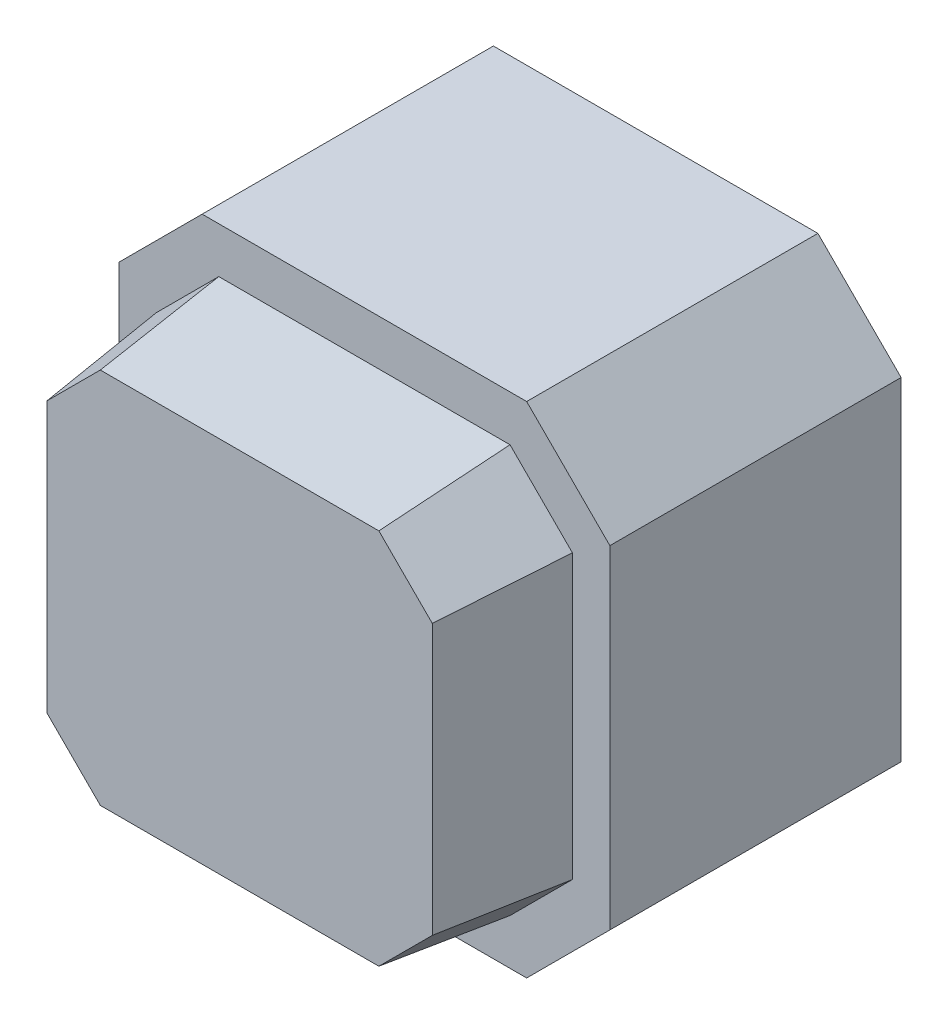
ISO-10303-21;
HEADER;
FILE_DESCRIPTION(('STEP AP214'),'2;1');
FILE_NAME('part.step','',(''),(''),'','','');
FILE_SCHEMA(('AUTOMOTIVE_DESIGN { 1 0 10303 214 1 1 1 1 }'));
ENDSEC;
DATA;
#1=APPLICATION_CONTEXT('core data for automotive mechanical design processes');
#2=APPLICATION_PROTOCOL_DEFINITION('international standard','automotive_design',2000,#1);
#3=PRODUCT_CONTEXT('',#1,'mechanical');
#4=PRODUCT('Part','Part','',(#3));
#5=PRODUCT_RELATED_PRODUCT_CATEGORY('part','',(#4));
#6=PRODUCT_DEFINITION_FORMATION('','',#4);
#7=PRODUCT_DEFINITION_CONTEXT('part definition',#1,'design');
#8=PRODUCT_DEFINITION('design','',#6,#7);
#9=PRODUCT_DEFINITION_SHAPE('','',#8);
#10=(LENGTH_UNIT() NAMED_UNIT(*) SI_UNIT(.MILLI.,.METRE.));
#11=(NAMED_UNIT(*) PLANE_ANGLE_UNIT() SI_UNIT($,.RADIAN.));
#12=(NAMED_UNIT(*) SI_UNIT($,.STERADIAN.) SOLID_ANGLE_UNIT());
#13=UNCERTAINTY_MEASURE_WITH_UNIT(LENGTH_MEASURE(1.E-05),#10,'distance_accuracy_value','');
#14=(GEOMETRIC_REPRESENTATION_CONTEXT(3) GLOBAL_UNCERTAINTY_ASSIGNED_CONTEXT((#13)) GLOBAL_UNIT_ASSIGNED_CONTEXT((#10,
#11,#12)) REPRESENTATION_CONTEXT('',''));
#15=CARTESIAN_POINT('',(0.,0.,0.));
#16=DIRECTION('',(0.,0.,1.));
#17=DIRECTION('',(1.,0.,0.));
#18=AXIS2_PLACEMENT_3D('',#15,#16,#17);
#19=CARTESIAN_POINT('',(0.,0.,3.5));
#20=DIRECTION('',(0.,0.,-1.));
#21=DIRECTION('',(-1.,0.,0.));
#22=AXIS2_PLACEMENT_3D('',#19,#20,#21);
#23=PLANE('',#22);
#24=DIRECTION('',(0.,-1.,0.));
#25=VECTOR('',#24,1.);
#26=CARTESIAN_POINT('',(-2.95,-2.,3.5));
#27=LINE('',#26,#25);
#28=CARTESIAN_POINT('',(-2.95,2.,3.5));
#29=VERTEX_POINT('',#28);
#30=CARTESIAN_POINT('',(-2.95,-2.,3.5));
#31=VERTEX_POINT('',#30);
#32=EDGE_CURVE('E241',#29,#31,#27,.T.);
#33=ORIENTED_EDGE('',*,*,#32,.T.);
#34=DIRECTION('',(0.707106781186548,-0.707106781186548,0.));
#35=VECTOR('',#34,1.);
#36=CARTESIAN_POINT('',(-1.95,-3.,3.5));
#37=LINE('',#36,#35);
#38=CARTESIAN_POINT('',(-1.95,-3.,3.5));
#39=VERTEX_POINT('',#38);
#40=EDGE_CURVE('E245',#31,#39,#37,.T.);
#41=ORIENTED_EDGE('',*,*,#40,.T.);
#42=DIRECTION('',(1.,0.,0.));
#43=VECTOR('',#42,1.);
#44=CARTESIAN_POINT('',(-1.95,-3.,3.5));
#45=LINE('',#44,#43);
#46=CARTESIAN_POINT('',(1.95,-3.,3.5));
#47=VERTEX_POINT('',#46);
#48=EDGE_CURVE('E249',#39,#47,#45,.T.);
#49=ORIENTED_EDGE('',*,*,#48,.T.);
#50=DIRECTION('',(0.707106781186548,0.707106781186548,0.));
#51=VECTOR('',#50,1.);
#52=CARTESIAN_POINT('',(1.95,-3.,3.5));
#53=LINE('',#52,#51);
#54=CARTESIAN_POINT('',(2.95,-2.,3.5));
#55=VERTEX_POINT('',#54);
#56=EDGE_CURVE('E252',#47,#55,#53,.T.);
#57=ORIENTED_EDGE('',*,*,#56,.T.);
#58=DIRECTION('',(0.,1.,0.));
#59=VECTOR('',#58,1.);
#60=CARTESIAN_POINT('',(2.95,-2.,3.5));
#61=LINE('',#60,#59);
#62=CARTESIAN_POINT('',(2.95,2.,3.5));
#63=VERTEX_POINT('',#62);
#64=EDGE_CURVE('E255',#55,#63,#61,.T.);
#65=ORIENTED_EDGE('',*,*,#64,.T.);
#66=DIRECTION('',(-0.707106781186548,0.707106781186548,0.));
#67=VECTOR('',#66,1.);
#68=CARTESIAN_POINT('',(1.95,3.,3.5));
#69=LINE('',#68,#67);
#70=CARTESIAN_POINT('',(1.95,3.,3.5));
#71=VERTEX_POINT('',#70);
#72=EDGE_CURVE('E258',#63,#71,#69,.T.);
#73=ORIENTED_EDGE('',*,*,#72,.T.);
#74=DIRECTION('',(-1.,0.,0.));
#75=VECTOR('',#74,1.);
#76=CARTESIAN_POINT('',(-1.95,3.,3.5));
#77=LINE('',#76,#75);
#78=CARTESIAN_POINT('',(-1.95,3.,3.5));
#79=VERTEX_POINT('',#78);
#80=EDGE_CURVE('E261',#71,#79,#77,.T.);
#81=ORIENTED_EDGE('',*,*,#80,.T.);
#82=DIRECTION('',(-0.707106781186548,-0.707106781186548,0.));
#83=VECTOR('',#82,1.);
#84=CARTESIAN_POINT('',(-2.95,2.,3.5));
#85=LINE('',#84,#83);
#86=EDGE_CURVE('E264',#79,#29,#85,.T.);
#87=ORIENTED_EDGE('',*,*,#86,.T.);
#88=EDGE_LOOP('',(#33,#41,#49,#57,#65,#73,#81,#87));
#89=FACE_BOUND('',#88,.T.);
#90=DIRECTION('',(0.,-1.,0.));
#91=VECTOR('',#90,1.);
#92=CARTESIAN_POINT('',(-2.5,-1.7,3.5));
#93=LINE('',#92,#91);
#94=CARTESIAN_POINT('',(-2.5,1.7,3.5));
#95=VERTEX_POINT('',#94);
#96=CARTESIAN_POINT('',(-2.5,-1.7,3.5));
#97=VERTEX_POINT('',#96);
#98=EDGE_CURVE('E59',#95,#97,#93,.T.);
#99=ORIENTED_EDGE('',*,*,#98,.F.);
#100=DIRECTION('',(-0.707106781186548,-0.707106781186548,0.));
#101=VECTOR('',#100,1.);
#102=CARTESIAN_POINT('',(-2.5,1.7,3.5));
#103=LINE('',#102,#101);
#104=CARTESIAN_POINT('',(-1.75,2.45,3.5));
#105=VERTEX_POINT('',#104);
#106=EDGE_CURVE('E66',#105,#95,#103,.T.);
#107=ORIENTED_EDGE('',*,*,#106,.F.);
#108=DIRECTION('',(-1.,0.,0.));
#109=VECTOR('',#108,1.);
#110=CARTESIAN_POINT('',(-1.75,2.45,3.5));
#111=LINE('',#110,#109);
#112=CARTESIAN_POINT('',(1.75,2.45,3.5));
#113=VERTEX_POINT('',#112);
#114=EDGE_CURVE('E547',#113,#105,#111,.T.);
#115=ORIENTED_EDGE('',*,*,#114,.F.);
#116=DIRECTION('',(-0.707106781186548,0.707106781186548,0.));
#117=VECTOR('',#116,1.);
#118=CARTESIAN_POINT('',(1.75,2.45,3.5));
#119=LINE('',#118,#117);
#120=CARTESIAN_POINT('',(2.5,1.7,3.5));
#121=VERTEX_POINT('',#120);
#122=EDGE_CURVE('E543',#121,#113,#119,.T.);
#123=ORIENTED_EDGE('',*,*,#122,.F.);
#124=DIRECTION('',(0.,1.,0.));
#125=VECTOR('',#124,1.);
#126=CARTESIAN_POINT('',(2.5,-1.7,3.5));
#127=LINE('',#126,#125);
#128=CARTESIAN_POINT('',(2.5,-1.7,3.5));
#129=VERTEX_POINT('',#128);
#130=EDGE_CURVE('E539',#129,#121,#127,.T.);
#131=ORIENTED_EDGE('',*,*,#130,.F.);
#132=DIRECTION('',(0.707106781186548,0.707106781186548,0.));
#133=VECTOR('',#132,1.);
#134=CARTESIAN_POINT('',(1.75,-2.45,3.5));
#135=LINE('',#134,#133);
#136=CARTESIAN_POINT('',(1.75,-2.45,3.5));
#137=VERTEX_POINT('',#136);
#138=EDGE_CURVE('E187',#137,#129,#135,.T.);
#139=ORIENTED_EDGE('',*,*,#138,.F.);
#140=DIRECTION('',(1.,0.,0.));
#141=VECTOR('',#140,1.);
#142=CARTESIAN_POINT('',(-1.75,-2.45,3.5));
#143=LINE('',#142,#141);
#144=CARTESIAN_POINT('',(-1.75,-2.45,3.5));
#145=VERTEX_POINT('',#144);
#146=EDGE_CURVE('E182',#145,#137,#143,.T.);
#147=ORIENTED_EDGE('',*,*,#146,.F.);
#148=DIRECTION('',(0.707106781186548,-0.707106781186548,0.));
#149=VECTOR('',#148,1.);
#150=CARTESIAN_POINT('',(-2.5,-1.7,3.5));
#151=LINE('',#150,#149);
#152=EDGE_CURVE('E184',#97,#145,#151,.T.);
#153=ORIENTED_EDGE('',*,*,#152,.F.);
#154=EDGE_LOOP('',(#99,#107,#115,#123,#131,#139,#147,#153));
#155=FACE_BOUND('',#154,.T.);
#156=ADVANCED_FACE('F40',(#89,#155),#23,.F.);
#157=CARTESIAN_POINT('',(-2.95,-2.,3.5));
#158=DIRECTION('',(1.,0.,0.));
#159=DIRECTION('',(0.,0.,-1.));
#160=AXIS2_PLACEMENT_3D('',#157,#158,#159);
#161=PLANE('',#160);
#162=DIRECTION('',(0.,-1.,0.));
#163=VECTOR('',#162,1.);
#164=CARTESIAN_POINT('',(-2.95,-2.,0.));
#165=LINE('',#164,#163);
#166=CARTESIAN_POINT('',(-2.95,2.,0.));
#167=VERTEX_POINT('',#166);
#168=CARTESIAN_POINT('',(-2.95,-2.,0.));
#169=VERTEX_POINT('',#168);
#170=EDGE_CURVE('E210',#167,#169,#165,.T.);
#171=ORIENTED_EDGE('',*,*,#170,.T.);
#172=DIRECTION('',(0.,0.,-1.));
#173=VECTOR('',#172,1.);
#174=CARTESIAN_POINT('',(-2.95,-2.,3.5));
#175=LINE('',#174,#173);
#176=EDGE_CURVE('E11',#31,#169,#175,.T.);
#177=ORIENTED_EDGE('',*,*,#176,.F.);
#178=ORIENTED_EDGE('',*,*,#32,.F.);
#179=DIRECTION('',(0.,0.,-1.));
#180=VECTOR('',#179,1.);
#181=CARTESIAN_POINT('',(-2.95,2.,3.5));
#182=LINE('',#181,#180);
#183=EDGE_CURVE('E267',#29,#167,#182,.T.);
#184=ORIENTED_EDGE('',*,*,#183,.T.);
#185=EDGE_LOOP('',(#171,#177,#178,#184));
#186=FACE_BOUND('',#185,.T.);
#187=ADVANCED_FACE('F42',(#186),#161,.F.);
#188=CARTESIAN_POINT('',(-1.95,-3.,3.5));
#189=DIRECTION('',(0.707106781186547,0.707106781186547,0.));
#190=DIRECTION('',(-0.707106781186548,0.707106781186548,0.));
#191=AXIS2_PLACEMENT_3D('',#188,#189,#190);
#192=PLANE('',#191);
#193=DIRECTION('',(0.707106781186548,-0.707106781186548,0.));
#194=VECTOR('',#193,1.);
#195=CARTESIAN_POINT('',(-1.95,-3.,0.));
#196=LINE('',#195,#194);
#197=CARTESIAN_POINT('',(-1.95,-3.,0.));
#198=VERTEX_POINT('',#197);
#199=EDGE_CURVE('E271',#169,#198,#196,.T.);
#200=ORIENTED_EDGE('',*,*,#199,.T.);
#201=DIRECTION('',(0.,0.,-1.));
#202=VECTOR('',#201,1.);
#203=CARTESIAN_POINT('',(-1.95,-3.,3.5));
#204=LINE('',#203,#202);
#205=EDGE_CURVE('E49',#39,#198,#204,.T.);
#206=ORIENTED_EDGE('',*,*,#205,.F.);
#207=ORIENTED_EDGE('',*,*,#40,.F.);
#208=ORIENTED_EDGE('',*,*,#176,.T.);
#209=EDGE_LOOP('',(#200,#206,#207,#208));
#210=FACE_BOUND('',#209,.T.);
#211=ADVANCED_FACE('F341',(#210),#192,.F.);
#212=CARTESIAN_POINT('',(-1.95,-3.,3.5));
#213=DIRECTION('',(0.,1.,0.));
#214=DIRECTION('',(0.,0.,1.));
#215=AXIS2_PLACEMENT_3D('',#212,#213,#214);
#216=PLANE('',#215);
#217=DIRECTION('',(1.,0.,0.));
#218=VECTOR('',#217,1.);
#219=CARTESIAN_POINT('',(-1.95,-3.,0.));
#220=LINE('',#219,#218);
#221=CARTESIAN_POINT('',(1.95,-3.,0.));
#222=VERTEX_POINT('',#221);
#223=EDGE_CURVE('E274',#198,#222,#220,.T.);
#224=ORIENTED_EDGE('',*,*,#223,.T.);
#225=DIRECTION('',(0.,0.,-1.));
#226=VECTOR('',#225,1.);
#227=CARTESIAN_POINT('',(1.95,-3.,3.5));
#228=LINE('',#227,#226);
#229=EDGE_CURVE('E310',#47,#222,#228,.T.);
#230=ORIENTED_EDGE('',*,*,#229,.F.);
#231=ORIENTED_EDGE('',*,*,#48,.F.);
#232=ORIENTED_EDGE('',*,*,#205,.T.);
#233=EDGE_LOOP('',(#224,#230,#231,#232));
#234=FACE_BOUND('',#233,.T.);
#235=ADVANCED_FACE('F319',(#234),#216,.F.);
#236=CARTESIAN_POINT('',(1.95,-3.,3.5));
#237=DIRECTION('',(-0.707106781186547,0.707106781186547,0.));
#238=DIRECTION('',(-0.707106781186548,-0.707106781186548,0.));
#239=AXIS2_PLACEMENT_3D('',#236,#237,#238);
#240=PLANE('',#239);
#241=DIRECTION('',(0.707106781186548,0.707106781186548,0.));
#242=VECTOR('',#241,1.);
#243=CARTESIAN_POINT('',(1.95,-3.,0.));
#244=LINE('',#243,#242);
#245=CARTESIAN_POINT('',(2.95,-2.,0.));
#246=VERTEX_POINT('',#245);
#247=EDGE_CURVE('E277',#222,#246,#244,.T.);
#248=ORIENTED_EDGE('',*,*,#247,.T.);
#249=DIRECTION('',(0.,0.,-1.));
#250=VECTOR('',#249,1.);
#251=CARTESIAN_POINT('',(2.95,-2.,3.5));
#252=LINE('',#251,#250);
#253=EDGE_CURVE('E306',#55,#246,#252,.T.);
#254=ORIENTED_EDGE('',*,*,#253,.F.);
#255=ORIENTED_EDGE('',*,*,#56,.F.);
#256=ORIENTED_EDGE('',*,*,#229,.T.);
#257=EDGE_LOOP('',(#248,#254,#255,#256));
#258=FACE_BOUND('',#257,.T.);
#259=ADVANCED_FACE('F330',(#258),#240,.F.);
#260=CARTESIAN_POINT('',(2.95,-2.,3.5));
#261=DIRECTION('',(-1.,0.,0.));
#262=DIRECTION('',(0.,0.,1.));
#263=AXIS2_PLACEMENT_3D('',#260,#261,#262);
#264=PLANE('',#263);
#265=DIRECTION('',(0.,1.,0.));
#266=VECTOR('',#265,1.);
#267=CARTESIAN_POINT('',(2.95,-2.,0.));
#268=LINE('',#267,#266);
#269=CARTESIAN_POINT('',(2.95,2.,0.));
#270=VERTEX_POINT('',#269);
#271=EDGE_CURVE('E280',#246,#270,#268,.T.);
#272=ORIENTED_EDGE('',*,*,#271,.T.);
#273=DIRECTION('',(0.,0.,-1.));
#274=VECTOR('',#273,1.);
#275=CARTESIAN_POINT('',(2.95,2.,3.5));
#276=LINE('',#275,#274);
#277=EDGE_CURVE('E302',#63,#270,#276,.T.);
#278=ORIENTED_EDGE('',*,*,#277,.F.);
#279=ORIENTED_EDGE('',*,*,#64,.F.);
#280=ORIENTED_EDGE('',*,*,#253,.T.);
#281=EDGE_LOOP('',(#272,#278,#279,#280));
#282=FACE_BOUND('',#281,.T.);
#283=ADVANCED_FACE('F334',(#282),#264,.F.);
#284=CARTESIAN_POINT('',(1.95,3.,3.5));
#285=DIRECTION('',(-0.707106781186547,-0.707106781186547,0.));
#286=DIRECTION('',(0.707106781186548,-0.707106781186548,0.));
#287=AXIS2_PLACEMENT_3D('',#284,#285,#286);
#288=PLANE('',#287);
#289=DIRECTION('',(-0.707106781186548,0.707106781186548,0.));
#290=VECTOR('',#289,1.);
#291=CARTESIAN_POINT('',(1.95,3.,0.));
#292=LINE('',#291,#290);
#293=CARTESIAN_POINT('',(1.95,3.,0.));
#294=VERTEX_POINT('',#293);
#295=EDGE_CURVE('E283',#270,#294,#292,.T.);
#296=ORIENTED_EDGE('',*,*,#295,.T.);
#297=DIRECTION('',(0.,0.,-1.));
#298=VECTOR('',#297,1.);
#299=CARTESIAN_POINT('',(1.95,3.,3.5));
#300=LINE('',#299,#298);
#301=EDGE_CURVE('E298',#71,#294,#300,.T.);
#302=ORIENTED_EDGE('',*,*,#301,.F.);
#303=ORIENTED_EDGE('',*,*,#72,.F.);
#304=ORIENTED_EDGE('',*,*,#277,.T.);
#305=EDGE_LOOP('',(#296,#302,#303,#304));
#306=FACE_BOUND('',#305,.T.);
#307=ADVANCED_FACE('F354',(#306),#288,.F.);
#308=CARTESIAN_POINT('',(-1.95,3.,3.5));
#309=DIRECTION('',(0.,-1.,0.));
#310=DIRECTION('',(0.,0.,-1.));
#311=AXIS2_PLACEMENT_3D('',#308,#309,#310);
#312=PLANE('',#311);
#313=DIRECTION('',(-1.,0.,0.));
#314=VECTOR('',#313,1.);
#315=CARTESIAN_POINT('',(-1.95,3.,0.));
#316=LINE('',#315,#314);
#317=CARTESIAN_POINT('',(-1.95,3.,0.));
#318=VERTEX_POINT('',#317);
#319=EDGE_CURVE('E286',#294,#318,#316,.T.);
#320=ORIENTED_EDGE('',*,*,#319,.T.);
#321=DIRECTION('',(0.,0.,-1.));
#322=VECTOR('',#321,1.);
#323=CARTESIAN_POINT('',(-1.95,3.,3.5));
#324=LINE('',#323,#322);
#325=EDGE_CURVE('E294',#79,#318,#324,.T.);
#326=ORIENTED_EDGE('',*,*,#325,.F.);
#327=ORIENTED_EDGE('',*,*,#80,.F.);
#328=ORIENTED_EDGE('',*,*,#301,.T.);
#329=EDGE_LOOP('',(#320,#326,#327,#328));
#330=FACE_BOUND('',#329,.T.);
#331=ADVANCED_FACE('F352',(#330),#312,.F.);
#332=CARTESIAN_POINT('',(-2.95,2.,3.5));
#333=DIRECTION('',(0.707106781186547,-0.707106781186547,0.));
#334=DIRECTION('',(0.707106781186548,0.707106781186548,0.));
#335=AXIS2_PLACEMENT_3D('',#332,#333,#334);
#336=PLANE('',#335);
#337=DIRECTION('',(-0.707106781186548,-0.707106781186548,0.));
#338=VECTOR('',#337,1.);
#339=CARTESIAN_POINT('',(-2.95,2.,0.));
#340=LINE('',#339,#338);
#341=EDGE_CURVE('E246',#318,#167,#340,.T.);
#342=ORIENTED_EDGE('',*,*,#341,.T.);
#343=ORIENTED_EDGE('',*,*,#183,.F.);
#344=ORIENTED_EDGE('',*,*,#86,.F.);
#345=ORIENTED_EDGE('',*,*,#325,.T.);
#346=EDGE_LOOP('',(#342,#343,#344,#345));
#347=FACE_BOUND('',#346,.T.);
#348=ADVANCED_FACE('F347',(#347),#336,.F.);
#349=CARTESIAN_POINT('',(0.,0.,0.));
#350=DIRECTION('',(0.,0.,-1.));
#351=DIRECTION('',(-1.,0.,0.));
#352=AXIS2_PLACEMENT_3D('',#349,#350,#351);
#353=PLANE('',#352);
#354=ORIENTED_EDGE('',*,*,#170,.F.);
#355=ORIENTED_EDGE('',*,*,#341,.F.);
#356=ORIENTED_EDGE('',*,*,#319,.F.);
#357=ORIENTED_EDGE('',*,*,#295,.F.);
#358=ORIENTED_EDGE('',*,*,#271,.F.);
#359=ORIENTED_EDGE('',*,*,#247,.F.);
#360=ORIENTED_EDGE('',*,*,#223,.F.);
#361=ORIENTED_EDGE('',*,*,#199,.F.);
#362=EDGE_LOOP('',(#354,#355,#356,#357,#358,#359,#360,#361));
#363=FACE_BOUND('',#362,.T.);
#364=ADVANCED_FACE('F325',(#363),#353,.T.);
#365=CARTESIAN_POINT('',(-2.5,-1.7,3.5));
#366=DIRECTION('',(-0.992546151641322,0.,0.121869343405148));
#367=DIRECTION('',(0.121869343405148,0.,0.992546151641322));
#368=AXIS2_PLACEMENT_3D('',#365,#366,#367);
#369=PLANE('',#368);
#370=ORIENTED_EDGE('',*,*,#98,.T.);
#371=DIRECTION('',(-0.121714364351113,-0.0504157404498515,-0.991283948536189));
#372=VECTOR('',#371,1.);
#373=CARTESIAN_POINT('',(-2.5,-1.7,3.5));
#374=LINE('',#373,#372);
#375=CARTESIAN_POINT('',(-2.31582315864564,-1.62371145443599,5.));
#376=VERTEX_POINT('',#375);
#377=EDGE_CURVE('E200',#376,#97,#374,.T.);
#378=ORIENTED_EDGE('',*,*,#377,.F.);
#379=DIRECTION('',(0.,1.,0.));
#380=VECTOR('',#379,1.);
#381=CARTESIAN_POINT('',(-2.31582315864564,0.,5.));
#382=LINE('',#381,#380);
#383=CARTESIAN_POINT('',(-2.31582315864564,1.62371145443599,5.));
#384=VERTEX_POINT('',#383);
#385=EDGE_CURVE('E217',#384,#376,#382,.F.);
#386=ORIENTED_EDGE('',*,*,#385,.F.);
#387=DIRECTION('',(-0.121714364351113,0.0504157404498515,-0.991283948536189));
#388=VECTOR('',#387,1.);
#389=CARTESIAN_POINT('',(-2.47913651267271,1.69135806059064,3.66991946848912));
#390=LINE('',#389,#388);
#391=EDGE_CURVE('E240',#384,#95,#390,.T.);
#392=ORIENTED_EDGE('',*,*,#391,.T.);
#393=EDGE_LOOP('',(#370,#378,#386,#392));
#394=FACE_BOUND('',#393,.T.);
#395=ADVANCED_FACE('F373',(#394),#369,.T.);
#396=CARTESIAN_POINT('',(-2.5,-1.7,3.5));
#397=DIRECTION('',(-0.70183611446619,-0.70183611446619,0.121869343405148));
#398=DIRECTION('',(0.707106781186547,-0.707106781186547,0.));
#399=AXIS2_PLACEMENT_3D('',#396,#397,#398);
#400=PLANE('',#399);
#401=ORIENTED_EDGE('',*,*,#152,.T.);
#402=DIRECTION('',(-0.0504157404498515,-0.121714364351113,-0.991283948536189));
#403=VECTOR('',#402,1.);
#404=CARTESIAN_POINT('',(-1.75,-2.45,3.5));
#405=LINE('',#404,#403);
#406=CARTESIAN_POINT('',(-1.67371145443599,-2.26582315864564,5.));
#407=VERTEX_POINT('',#406);
#408=EDGE_CURVE('E197',#407,#145,#405,.T.);
#409=ORIENTED_EDGE('',*,*,#408,.F.);
#410=DIRECTION('',(-0.707106781186547,0.707106781186547,0.));
#411=VECTOR('',#410,1.);
#412=CARTESIAN_POINT('',(-1.96976730654082,-1.96976730654082,5.));
#413=LINE('',#412,#411);
#414=EDGE_CURVE('E221',#376,#407,#413,.F.);
#415=ORIENTED_EDGE('',*,*,#414,.F.);
#416=ORIENTED_EDGE('',*,*,#377,.T.);
#417=EDGE_LOOP('',(#401,#409,#415,#416));
#418=FACE_BOUND('',#417,.T.);
#419=ADVANCED_FACE('F196',(#418),#400,.T.);
#420=CARTESIAN_POINT('',(-1.75,-2.45,3.5));
#421=DIRECTION('',(0.,-0.992546151641322,0.121869343405148));
#422=DIRECTION('',(0.,-0.121869343405148,-0.992546151641322));
#423=AXIS2_PLACEMENT_3D('',#420,#421,#422);
#424=PLANE('',#423);
#425=ORIENTED_EDGE('',*,*,#146,.T.);
#426=DIRECTION('',(0.0504157404498515,-0.121714364351113,-0.991283948536189));
#427=VECTOR('',#426,1.);
#428=CARTESIAN_POINT('',(1.75,-2.45,3.5));
#429=LINE('',#428,#427);
#430=CARTESIAN_POINT('',(1.67371145443599,-2.26582315864564,5.));
#431=VERTEX_POINT('',#430);
#432=EDGE_CURVE('E206',#431,#137,#429,.T.);
#433=ORIENTED_EDGE('',*,*,#432,.F.);
#434=DIRECTION('',(-1.,0.,0.));
#435=VECTOR('',#434,1.);
#436=CARTESIAN_POINT('',(0.,-2.26582315864564,5.));
#437=LINE('',#436,#435);
#438=EDGE_CURVE('E204',#407,#431,#437,.F.);
#439=ORIENTED_EDGE('',*,*,#438,.F.);
#440=ORIENTED_EDGE('',*,*,#408,.T.);
#441=EDGE_LOOP('',(#425,#433,#439,#440));
#442=FACE_BOUND('',#441,.T.);
#443=ADVANCED_FACE('F203',(#442),#424,.T.);
#444=CARTESIAN_POINT('',(1.75,-2.45,3.5));
#445=DIRECTION('',(0.70183611446619,-0.70183611446619,0.121869343405148));
#446=DIRECTION('',(0.707106781186547,0.707106781186547,0.));
#447=AXIS2_PLACEMENT_3D('',#444,#445,#446);
#448=PLANE('',#447);
#449=ORIENTED_EDGE('',*,*,#138,.T.);
#450=DIRECTION('',(0.121714364351113,-0.0504157404498515,-0.991283948536189));
#451=VECTOR('',#450,1.);
#452=CARTESIAN_POINT('',(2.5,-1.7,3.5));
#453=LINE('',#452,#451);
#454=CARTESIAN_POINT('',(2.31582315864564,-1.62371145443599,5.));
#455=VERTEX_POINT('',#454);
#456=EDGE_CURVE('E213',#455,#129,#453,.T.);
#457=ORIENTED_EDGE('',*,*,#456,.F.);
#458=DIRECTION('',(-0.707106781186547,-0.707106781186547,0.));
#459=VECTOR('',#458,1.);
#460=CARTESIAN_POINT('',(1.96976730654082,-1.96976730654082,5.));
#461=LINE('',#460,#459);
#462=EDGE_CURVE('E225',#431,#455,#461,.F.);
#463=ORIENTED_EDGE('',*,*,#462,.F.);
#464=ORIENTED_EDGE('',*,*,#432,.T.);
#465=EDGE_LOOP('',(#449,#457,#463,#464));
#466=FACE_BOUND('',#465,.T.);
#467=ADVANCED_FACE('F402',(#466),#448,.T.);
#468=CARTESIAN_POINT('',(2.5,-1.7,3.5));
#469=DIRECTION('',(0.992546151641322,0.,0.121869343405148));
#470=DIRECTION('',(0.121869343405148,0.,-0.992546151641322));
#471=AXIS2_PLACEMENT_3D('',#468,#469,#470);
#472=PLANE('',#471);
#473=ORIENTED_EDGE('',*,*,#130,.T.);
#474=DIRECTION('',(0.121714364351113,0.0504157404498515,-0.991283948536189));
#475=VECTOR('',#474,1.);
#476=CARTESIAN_POINT('',(2.49349144998456,1.69730407031222,3.55300788606953));
#477=LINE('',#476,#475);
#478=CARTESIAN_POINT('',(2.31582315864564,1.62371145443599,5.));
#479=VERTEX_POINT('',#478);
#480=EDGE_CURVE('E560',#479,#121,#477,.T.);
#481=ORIENTED_EDGE('',*,*,#480,.F.);
#482=DIRECTION('',(0.,-1.,0.));
#483=VECTOR('',#482,1.);
#484=CARTESIAN_POINT('',(2.31582315864564,0.,5.));
#485=LINE('',#484,#483);
#486=EDGE_CURVE('E228',#455,#479,#485,.F.);
#487=ORIENTED_EDGE('',*,*,#486,.F.);
#488=ORIENTED_EDGE('',*,*,#456,.T.);
#489=EDGE_LOOP('',(#473,#481,#487,#488));
#490=FACE_BOUND('',#489,.T.);
#491=ADVANCED_FACE('F408',(#490),#472,.T.);
#492=CARTESIAN_POINT('',(1.75,2.45,3.5));
#493=DIRECTION('',(0.70183611446619,0.70183611446619,0.121869343405148));
#494=DIRECTION('',(-0.707106781186547,0.707106781186547,0.));
#495=AXIS2_PLACEMENT_3D('',#492,#493,#494);
#496=PLANE('',#495);
#497=ORIENTED_EDGE('',*,*,#122,.T.);
#498=DIRECTION('',(0.0504157404498515,0.121714364351113,-0.991283948536189));
#499=VECTOR('',#498,1.);
#500=CARTESIAN_POINT('',(1.74110388590213,2.4285228806925,3.67491709991527));
#501=LINE('',#500,#499);
#502=CARTESIAN_POINT('',(1.67371145443599,2.26582315864564,5.));
#503=VERTEX_POINT('',#502);
#504=EDGE_CURVE('E556',#503,#113,#501,.T.);
#505=ORIENTED_EDGE('',*,*,#504,.F.);
#506=DIRECTION('',(0.707106781186547,-0.707106781186547,0.));
#507=VECTOR('',#506,1.);
#508=CARTESIAN_POINT('',(1.96976730654082,1.96976730654082,5.));
#509=LINE('',#508,#507);
#510=EDGE_CURVE('E231',#479,#503,#509,.F.);
#511=ORIENTED_EDGE('',*,*,#510,.F.);
#512=ORIENTED_EDGE('',*,*,#480,.T.);
#513=EDGE_LOOP('',(#497,#505,#511,#512));
#514=FACE_BOUND('',#513,.T.);
#515=ADVANCED_FACE('F416',(#514),#496,.T.);
#516=CARTESIAN_POINT('',(-1.75,2.45,3.5));
#517=DIRECTION('',(0.,0.992546151641322,0.121869343405148));
#518=DIRECTION('',(0.,-0.121869343405148,0.992546151641322));
#519=AXIS2_PLACEMENT_3D('',#516,#517,#518);
#520=PLANE('',#519);
#521=ORIENTED_EDGE('',*,*,#114,.T.);
#522=DIRECTION('',(-0.0504157404498515,0.121714364351113,-0.991283948536189));
#523=VECTOR('',#522,1.);
#524=CARTESIAN_POINT('',(-1.74730407031222,2.44349144998456,3.55300788606953));
#525=LINE('',#524,#523);
#526=CARTESIAN_POINT('',(-1.67371145443599,2.26582315864564,5.));
#527=VERTEX_POINT('',#526);
#528=EDGE_CURVE('E552',#527,#105,#525,.T.);
#529=ORIENTED_EDGE('',*,*,#528,.F.);
#530=DIRECTION('',(1.,0.,0.));
#531=VECTOR('',#530,1.);
#532=CARTESIAN_POINT('',(0.,2.26582315864564,5.));
#533=LINE('',#532,#531);
#534=EDGE_CURVE('E234',#503,#527,#533,.F.);
#535=ORIENTED_EDGE('',*,*,#534,.F.);
#536=ORIENTED_EDGE('',*,*,#504,.T.);
#537=EDGE_LOOP('',(#521,#529,#535,#536));
#538=FACE_BOUND('',#537,.T.);
#539=ADVANCED_FACE('F422',(#538),#520,.T.);
#540=CARTESIAN_POINT('',(-2.5,1.7,3.5));
#541=DIRECTION('',(-0.70183611446619,0.70183611446619,0.121869343405148));
#542=DIRECTION('',(-0.707106781186547,-0.707106781186547,0.));
#543=AXIS2_PLACEMENT_3D('',#540,#541,#542);
#544=PLANE('',#543);
#545=ORIENTED_EDGE('',*,*,#106,.T.);
#546=ORIENTED_EDGE('',*,*,#391,.F.);
#547=DIRECTION('',(0.707106781186547,0.707106781186547,0.));
#548=VECTOR('',#547,1.);
#549=CARTESIAN_POINT('',(-1.96976730654082,1.96976730654082,5.));
#550=LINE('',#549,#548);
#551=EDGE_CURVE('E237',#527,#384,#550,.F.);
#552=ORIENTED_EDGE('',*,*,#551,.F.);
#553=ORIENTED_EDGE('',*,*,#528,.T.);
#554=EDGE_LOOP('',(#545,#546,#552,#553));
#555=FACE_BOUND('',#554,.T.);
#556=ADVANCED_FACE('F430',(#555),#544,.T.);
#557=CARTESIAN_POINT('',(0.,0.,5.));
#558=DIRECTION('',(0.,0.,-1.));
#559=DIRECTION('',(-1.,0.,0.));
#560=AXIS2_PLACEMENT_3D('',#557,#558,#559);
#561=PLANE('',#560);
#562=ORIENTED_EDGE('',*,*,#385,.T.);
#563=ORIENTED_EDGE('',*,*,#414,.T.);
#564=ORIENTED_EDGE('',*,*,#438,.T.);
#565=ORIENTED_EDGE('',*,*,#462,.T.);
#566=ORIENTED_EDGE('',*,*,#486,.T.);
#567=ORIENTED_EDGE('',*,*,#510,.T.);
#568=ORIENTED_EDGE('',*,*,#534,.T.);
#569=ORIENTED_EDGE('',*,*,#551,.T.);
#570=EDGE_LOOP('',(#562,#563,#564,#565,#566,#567,#568,#569));
#571=FACE_BOUND('',#570,.T.);
#572=ADVANCED_FACE('F438',(#571),#561,.F.);
#573=CLOSED_SHELL('',(#156,#187,#211,#235,#259,#283,#307,#331,#348,#364,#395,#419,#443,#467,
#491,#515,#539,#556,#572));
#574=MANIFOLD_SOLID_BREP('B2',#573);
#575=ADVANCED_BREP_SHAPE_REPRESENTATION('',(#18,#574),#14);
#576=SHAPE_DEFINITION_REPRESENTATION(#9,#575);
ENDSEC;
END-ISO-10303-21;
